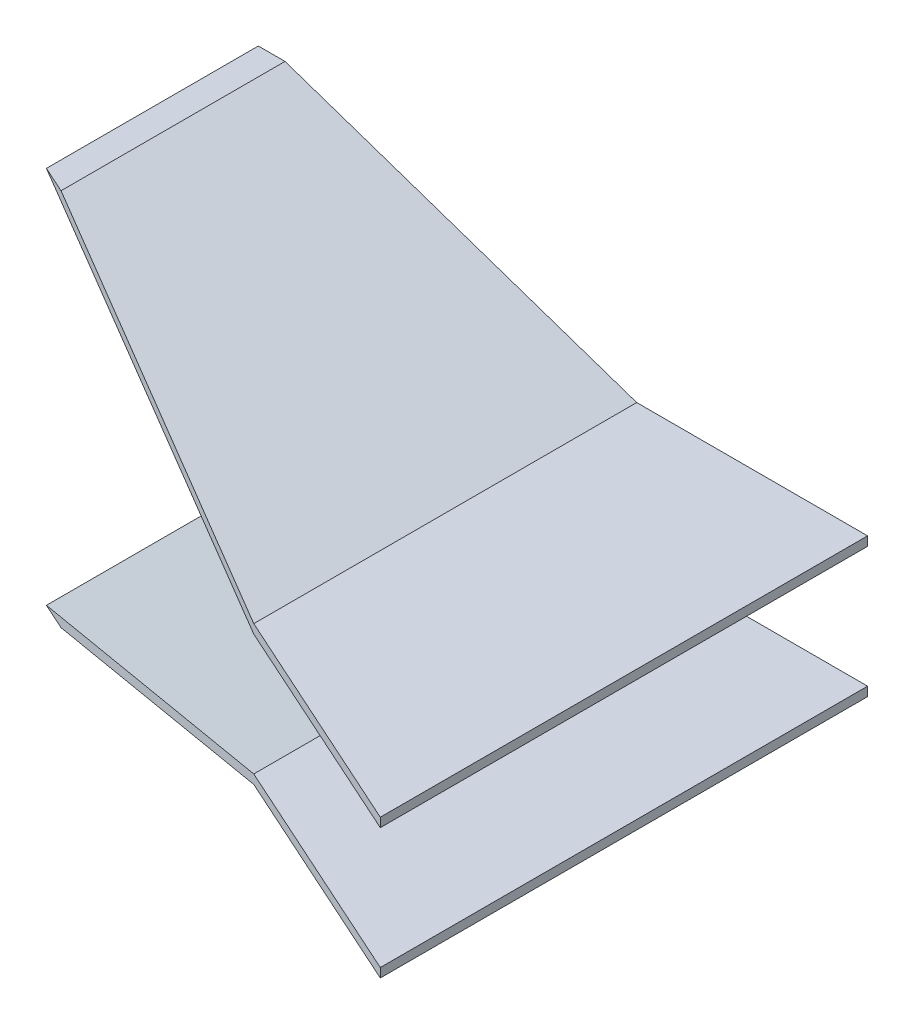
ISO-10303-21;
HEADER;
FILE_DESCRIPTION(('STEP AP214'),'2;1');
FILE_NAME('part.step','',(''),(''),'','','');
FILE_SCHEMA(('AUTOMOTIVE_DESIGN { 1 0 10303 214 1 1 1 1 }'));
ENDSEC;
DATA;
#1=APPLICATION_CONTEXT('core data for automotive mechanical design processes');
#2=APPLICATION_PROTOCOL_DEFINITION('international standard','automotive_design',2000,#1);
#3=PRODUCT_CONTEXT('',#1,'mechanical');
#4=PRODUCT('Part','Part','',(#3));
#5=PRODUCT_RELATED_PRODUCT_CATEGORY('part','',(#4));
#6=PRODUCT_DEFINITION_FORMATION('','',#4);
#7=PRODUCT_DEFINITION_CONTEXT('part definition',#1,'design');
#8=PRODUCT_DEFINITION('design','',#6,#7);
#9=PRODUCT_DEFINITION_SHAPE('','',#8);
#10=(LENGTH_UNIT() NAMED_UNIT(*) SI_UNIT(.MILLI.,.METRE.));
#11=(NAMED_UNIT(*) PLANE_ANGLE_UNIT() SI_UNIT($,.RADIAN.));
#12=(NAMED_UNIT(*) SI_UNIT($,.STERADIAN.) SOLID_ANGLE_UNIT());
#13=UNCERTAINTY_MEASURE_WITH_UNIT(LENGTH_MEASURE(1.E-05),#10,'distance_accuracy_value','');
#14=(GEOMETRIC_REPRESENTATION_CONTEXT(3) GLOBAL_UNCERTAINTY_ASSIGNED_CONTEXT((#13)) GLOBAL_UNIT_ASSIGNED_CONTEXT((#10,
#11,#12)) REPRESENTATION_CONTEXT('',''));
#15=CARTESIAN_POINT('',(0.,0.,0.));
#16=DIRECTION('',(0.,0.,1.));
#17=DIRECTION('',(1.,0.,0.));
#18=AXIS2_PLACEMENT_3D('',#15,#16,#17);
#19=CARTESIAN_POINT('',(408.541281030826,-85.,818.));
#20=DIRECTION('',(0.,-1.,0.));
#21=DIRECTION('',(0.,0.,-1.));
#22=AXIS2_PLACEMENT_3D('',#19,#20,#21);
#23=PLANE('',#22);
#24=DIRECTION('',(0.,0.,-1.));
#25=VECTOR('',#24,1.);
#26=CARTESIAN_POINT('',(408.541281030826,-85.,818.));
#27=LINE('',#26,#25);
#28=CARTESIAN_POINT('',(408.541281030826,-85.,321.948659025934));
#29=VERTEX_POINT('',#28);
#30=CARTESIAN_POINT('',(408.541281030826,-85.,0.));
#31=VERTEX_POINT('',#30);
#32=EDGE_CURVE('E144',#29,#31,#27,.T.);
#33=ORIENTED_EDGE('',*,*,#32,.F.);
#34=DIRECTION('',(-0.911238237938031,0.,-0.41187968354799));
#35=VECTOR('',#34,1.);
#36=CARTESIAN_POINT('',(594.719526822818,-85.,406.101226123914));
#37=LINE('',#36,#35);
#38=CARTESIAN_POINT('',(256.,-85.,253.));
#39=VERTEX_POINT('',#38);
#40=EDGE_CURVE('E154',#29,#39,#37,.T.);
#41=ORIENTED_EDGE('',*,*,#40,.T.);
#42=DIRECTION('',(0.,0.,-1.));
#43=VECTOR('',#42,1.);
#44=CARTESIAN_POINT('',(256.,-85.,253.));
#45=LINE('',#44,#43);
#46=CARTESIAN_POINT('',(256.,-85.,0.));
#47=VERTEX_POINT('',#46);
#48=EDGE_CURVE('E123',#39,#47,#45,.T.);
#49=ORIENTED_EDGE('',*,*,#48,.T.);
#50=DIRECTION('',(-1.,0.,0.));
#51=VECTOR('',#50,1.);
#52=CARTESIAN_POINT('',(408.541281030826,-85.,0.));
#53=LINE('',#52,#51);
#54=EDGE_CURVE('E147',#31,#47,#53,.T.);
#55=ORIENTED_EDGE('',*,*,#54,.F.);
#56=EDGE_LOOP('',(#33,#41,#49,#55));
#57=FACE_BOUND('',#56,.T.);
#58=ADVANCED_FACE('F55',(#57),#23,.T.);
#59=CARTESIAN_POINT('',(408.541281030826,-79.,818.));
#60=DIRECTION('',(1.,0.,0.));
#61=DIRECTION('',(0.,0.,-1.));
#62=AXIS2_PLACEMENT_3D('',#59,#60,#61);
#63=PLANE('',#62);
#64=DIRECTION('',(0.,0.,-1.));
#65=VECTOR('',#64,1.);
#66=CARTESIAN_POINT('',(408.541281030826,-79.,818.));
#67=LINE('',#66,#65);
#68=CARTESIAN_POINT('',(408.541281030826,-79.,321.948659025934));
#69=VERTEX_POINT('',#68);
#70=CARTESIAN_POINT('',(408.541281030826,-79.,0.));
#71=VERTEX_POINT('',#70);
#72=EDGE_CURVE('E145',#69,#71,#67,.T.);
#73=ORIENTED_EDGE('',*,*,#72,.F.);
#74=DIRECTION('',(0.,-1.,0.));
#75=VECTOR('',#74,1.);
#76=CARTESIAN_POINT('',(408.541281030826,-79.,321.948659025934));
#77=LINE('',#76,#75);
#78=EDGE_CURVE('E70',#69,#29,#77,.T.);
#79=ORIENTED_EDGE('',*,*,#78,.T.);
#80=ORIENTED_EDGE('',*,*,#32,.T.);
#81=DIRECTION('',(0.,-1.,0.));
#82=VECTOR('',#81,1.);
#83=CARTESIAN_POINT('',(408.541281030826,-79.,0.));
#84=LINE('',#83,#82);
#85=EDGE_CURVE('E150',#71,#31,#84,.T.);
#86=ORIENTED_EDGE('',*,*,#85,.F.);
#87=EDGE_LOOP('',(#73,#79,#80,#86));
#88=FACE_BOUND('',#87,.T.);
#89=ADVANCED_FACE('F158',(#88),#63,.T.);
#90=CARTESIAN_POINT('',(256.,-79.,818.));
#91=DIRECTION('',(0.,1.,0.));
#92=DIRECTION('',(0.,0.,1.));
#93=AXIS2_PLACEMENT_3D('',#90,#91,#92);
#94=PLANE('',#93);
#95=DIRECTION('',(0.,0.,-1.));
#96=VECTOR('',#95,1.);
#97=CARTESIAN_POINT('',(256.,-79.,253.));
#98=LINE('',#97,#96);
#99=CARTESIAN_POINT('',(256.,-79.,253.));
#100=VERTEX_POINT('',#99);
#101=CARTESIAN_POINT('',(256.,-79.,0.));
#102=VERTEX_POINT('',#101);
#103=EDGE_CURVE('E114',#100,#102,#98,.T.);
#104=ORIENTED_EDGE('',*,*,#103,.F.);
#105=DIRECTION('',(0.911238237938031,0.,0.41187968354799));
#106=VECTOR('',#105,1.);
#107=CARTESIAN_POINT('',(468.056092149491,-79.,348.84935365157));
#108=LINE('',#107,#106);
#109=EDGE_CURVE('E12',#100,#69,#108,.T.);
#110=ORIENTED_EDGE('',*,*,#109,.T.);
#111=ORIENTED_EDGE('',*,*,#72,.T.);
#112=DIRECTION('',(1.,0.,0.));
#113=VECTOR('',#112,1.);
#114=CARTESIAN_POINT('',(256.,-79.,0.));
#115=LINE('',#114,#113);
#116=EDGE_CURVE('E117',#102,#71,#115,.T.);
#117=ORIENTED_EDGE('',*,*,#116,.F.);
#118=EDGE_LOOP('',(#104,#110,#111,#117));
#119=FACE_BOUND('',#118,.T.);
#120=ADVANCED_FACE('F115',(#119),#94,.T.);
#121=CARTESIAN_POINT('',(6.,-250.,140.));
#122=DIRECTION('',(-0.41187968354799,0.,0.911238237938031));
#123=DIRECTION('',(0.911238237938031,0.,0.41187968354799));
#124=AXIS2_PLACEMENT_3D('',#121,#122,#123);
#125=PLANE('',#124);
#126=DIRECTION('',(0.870419931987886,-0.295942776875875,0.393429809258525));
#127=VECTOR('',#126,1.);
#128=CARTESIAN_POINT('',(71.9441898804744,-16.4210245593627,169.806773825974));
#129=LINE('',#128,#127);
#130=CARTESIAN_POINT('',(23.6470588235242,0.,147.976470588233));
#131=VERTEX_POINT('',#130);
#132=EDGE_CURVE('E110',#131,#100,#129,.T.);
#133=ORIENTED_EDGE('',*,*,#132,.F.);
#134=DIRECTION('',(0.911238237938031,0.,0.41187968354799));
#135=VECTOR('',#134,1.);
#136=CARTESIAN_POINT('',(6.,0.,140.));
#137=LINE('',#136,#135);
#138=CARTESIAN_POINT('',(6.,0.,140.));
#139=VERTEX_POINT('',#138);
#140=EDGE_CURVE('E125',#139,#131,#137,.T.);
#141=ORIENTED_EDGE('',*,*,#140,.F.);
#142=DIRECTION('',(-0.870419931987885,0.295942776875881,-0.393429809258524));
#143=VECTOR('',#142,1.);
#144=CARTESIAN_POINT('',(70.3986229301525,-21.8955317962518,169.108177564429));
#145=LINE('',#144,#143);
#146=EDGE_CURVE('E130',#39,#139,#145,.T.);
#147=ORIENTED_EDGE('',*,*,#146,.F.);
#148=ORIENTED_EDGE('',*,*,#40,.F.);
#149=ORIENTED_EDGE('',*,*,#78,.F.);
#150=ORIENTED_EDGE('',*,*,#109,.F.);
#151=EDGE_LOOP('',(#133,#141,#147,#148,#149,#150));
#152=FACE_BOUND('',#151,.T.);
#153=ADVANCED_FACE('F57',(#152),#125,.T.);
#154=CARTESIAN_POINT('',(0.,0.,0.));
#155=DIRECTION('',(0.,-1.,0.));
#156=DIRECTION('',(0.,0.,-1.));
#157=AXIS2_PLACEMENT_3D('',#154,#155,#156);
#158=PLANE('',#157);
#159=ORIENTED_EDGE('',*,*,#140,.T.);
#160=DIRECTION('',(0.,0.,-1.));
#161=VECTOR('',#160,1.);
#162=CARTESIAN_POINT('',(23.6470588235242,0.,0.));
#163=LINE('',#162,#161);
#164=CARTESIAN_POINT('',(23.6470588235242,0.,0.));
#165=VERTEX_POINT('',#164);
#166=EDGE_CURVE('E63',#131,#165,#163,.T.);
#167=ORIENTED_EDGE('',*,*,#166,.T.);
#168=DIRECTION('',(1.,0.,0.));
#169=VECTOR('',#168,1.);
#170=CARTESIAN_POINT('',(23.6470588235242,0.,0.));
#171=LINE('',#170,#169);
#172=CARTESIAN_POINT('',(6.,0.,0.));
#173=VERTEX_POINT('',#172);
#174=EDGE_CURVE('E133',#173,#165,#171,.T.);
#175=ORIENTED_EDGE('',*,*,#174,.F.);
#176=DIRECTION('',(0.,0.,1.));
#177=VECTOR('',#176,1.);
#178=CARTESIAN_POINT('',(6.,0.,0.));
#179=LINE('',#178,#177);
#180=EDGE_CURVE('E77',#173,#139,#179,.T.);
#181=ORIENTED_EDGE('',*,*,#180,.T.);
#182=EDGE_LOOP('',(#159,#167,#175,#181));
#183=FACE_BOUND('',#182,.T.);
#184=ADVANCED_FACE('F132',(#183),#158,.F.);
#185=CARTESIAN_POINT('',(256.,-85.,253.));
#186=DIRECTION('',(0.321902733238702,0.946772744819713,0.));
#187=DIRECTION('',(-0.946772744819713,0.321902733238702,0.));
#188=AXIS2_PLACEMENT_3D('',#185,#186,#187);
#189=PLANE('',#188);
#190=ORIENTED_EDGE('',*,*,#146,.T.);
#191=ORIENTED_EDGE('',*,*,#180,.F.);
#192=DIRECTION('',(-0.946772744819713,0.321902733238702,0.));
#193=VECTOR('',#192,1.);
#194=CARTESIAN_POINT('',(6.,0.,0.));
#195=LINE('',#194,#193);
#196=EDGE_CURVE('E139',#47,#173,#195,.T.);
#197=ORIENTED_EDGE('',*,*,#196,.F.);
#198=ORIENTED_EDGE('',*,*,#48,.F.);
#199=EDGE_LOOP('',(#190,#191,#197,#198));
#200=FACE_BOUND('',#199,.T.);
#201=ADVANCED_FACE('F164',(#200),#189,.F.);
#202=CARTESIAN_POINT('',(2.45034062387888,7.20688418787924,253.));
#203=DIRECTION('',(-0.321902733238696,-0.946772744819715,0.));
#204=DIRECTION('',(0.946772744819715,-0.321902733238696,0.));
#205=AXIS2_PLACEMENT_3D('',#202,#203,#204);
#206=PLANE('',#205);
#207=ORIENTED_EDGE('',*,*,#132,.T.);
#208=ORIENTED_EDGE('',*,*,#103,.T.);
#209=DIRECTION('',(0.946772744819715,-0.321902733238696,0.));
#210=VECTOR('',#209,1.);
#211=CARTESIAN_POINT('',(256.,-79.,0.));
#212=LINE('',#211,#210);
#213=EDGE_CURVE('E136',#165,#102,#212,.T.);
#214=ORIENTED_EDGE('',*,*,#213,.F.);
#215=ORIENTED_EDGE('',*,*,#166,.F.);
#216=EDGE_LOOP('',(#207,#208,#214,#215));
#217=FACE_BOUND('',#216,.T.);
#218=ADVANCED_FACE('F122',(#217),#206,.F.);
#219=CARTESIAN_POINT('',(0.,0.,0.));
#220=DIRECTION('',(0.,0.,1.));
#221=DIRECTION('',(1.,0.,0.));
#222=AXIS2_PLACEMENT_3D('',#219,#220,#221);
#223=PLANE('',#222);
#224=ORIENTED_EDGE('',*,*,#213,.T.);
#225=ORIENTED_EDGE('',*,*,#116,.T.);
#226=ORIENTED_EDGE('',*,*,#85,.T.);
#227=ORIENTED_EDGE('',*,*,#54,.T.);
#228=ORIENTED_EDGE('',*,*,#196,.T.);
#229=ORIENTED_EDGE('',*,*,#174,.T.);
#230=EDGE_LOOP('',(#224,#225,#226,#227,#228,#229));
#231=FACE_BOUND('',#230,.T.);
#232=ADVANCED_FACE('F135',(#231),#223,.F.);
#233=CLOSED_SHELL('',(#58,#89,#120,#153,#184,#201,#218,#232));
#234=MANIFOLD_SOLID_BREP('B2',#233);
#235=CARTESIAN_POINT('',(408.541281030826,-165.,818.));
#236=DIRECTION('',(0.,1.,0.));
#237=DIRECTION('',(0.,0.,1.));
#238=AXIS2_PLACEMENT_3D('',#235,#236,#237);
#239=PLANE('',#238);
#240=DIRECTION('',(0.,0.,-1.));
#241=VECTOR('',#240,1.);
#242=CARTESIAN_POINT('',(256.,-165.,253.));
#243=LINE('',#242,#241);
#244=CARTESIAN_POINT('',(256.,-165.,253.));
#245=VERTEX_POINT('',#244);
#246=CARTESIAN_POINT('',(256.,-165.,0.));
#247=VERTEX_POINT('',#246);
#248=EDGE_CURVE('E341',#245,#247,#243,.T.);
#249=ORIENTED_EDGE('',*,*,#248,.F.);
#250=DIRECTION('',(0.911238237938031,0.,0.41187968354799));
#251=VECTOR('',#250,1.);
#252=CARTESIAN_POINT('',(594.719526822818,-165.,406.101226123914));
#253=LINE('',#252,#251);
#254=CARTESIAN_POINT('',(408.541281030826,-165.,321.948659025934));
#255=VERTEX_POINT('',#254);
#256=EDGE_CURVE('E332',#245,#255,#253,.T.);
#257=ORIENTED_EDGE('',*,*,#256,.T.);
#258=DIRECTION('',(0.,0.,-1.));
#259=VECTOR('',#258,1.);
#260=CARTESIAN_POINT('',(408.541281030826,-165.,818.));
#261=LINE('',#260,#259);
#262=CARTESIAN_POINT('',(408.541281030826,-165.,0.));
#263=VERTEX_POINT('',#262);
#264=EDGE_CURVE('E338',#255,#263,#261,.T.);
#265=ORIENTED_EDGE('',*,*,#264,.T.);
#266=DIRECTION('',(1.,0.,0.));
#267=VECTOR('',#266,1.);
#268=CARTESIAN_POINT('',(408.541281030826,-165.,0.));
#269=LINE('',#268,#267);
#270=EDGE_CURVE('E361',#247,#263,#269,.T.);
#271=ORIENTED_EDGE('',*,*,#270,.F.);
#272=EDGE_LOOP('',(#249,#257,#265,#271));
#273=FACE_BOUND('',#272,.T.);
#274=ADVANCED_FACE('F278',(#273),#239,.T.);
#275=CARTESIAN_POINT('',(256.,-171.,818.));
#276=DIRECTION('',(0.,-1.,0.));
#277=DIRECTION('',(0.,0.,-1.));
#278=AXIS2_PLACEMENT_3D('',#275,#276,#277);
#279=PLANE('',#278);
#280=DIRECTION('',(0.,0.,-1.));
#281=VECTOR('',#280,1.);
#282=CARTESIAN_POINT('',(408.541281030826,-171.,818.));
#283=LINE('',#282,#281);
#284=CARTESIAN_POINT('',(408.541281030826,-171.,321.948659025934));
#285=VERTEX_POINT('',#284);
#286=CARTESIAN_POINT('',(408.541281030826,-171.,0.));
#287=VERTEX_POINT('',#286);
#288=EDGE_CURVE('E343',#285,#287,#283,.T.);
#289=ORIENTED_EDGE('',*,*,#288,.F.);
#290=DIRECTION('',(-0.911238237938031,0.,-0.41187968354799));
#291=VECTOR('',#290,1.);
#292=CARTESIAN_POINT('',(468.056092149491,-171.,348.84935365157));
#293=LINE('',#292,#291);
#294=CARTESIAN_POINT('',(256.,-171.,253.));
#295=VERTEX_POINT('',#294);
#296=EDGE_CURVE('E294',#285,#295,#293,.T.);
#297=ORIENTED_EDGE('',*,*,#296,.T.);
#298=DIRECTION('',(0.,0.,-1.));
#299=VECTOR('',#298,1.);
#300=CARTESIAN_POINT('',(256.,-171.,253.));
#301=LINE('',#300,#299);
#302=CARTESIAN_POINT('',(256.,-171.,0.));
#303=VERTEX_POINT('',#302);
#304=EDGE_CURVE('E377',#295,#303,#301,.T.);
#305=ORIENTED_EDGE('',*,*,#304,.T.);
#306=DIRECTION('',(-1.,0.,0.));
#307=VECTOR('',#306,1.);
#308=CARTESIAN_POINT('',(256.,-171.,0.));
#309=LINE('',#308,#307);
#310=EDGE_CURVE('E350',#287,#303,#309,.T.);
#311=ORIENTED_EDGE('',*,*,#310,.F.);
#312=EDGE_LOOP('',(#289,#297,#305,#311));
#313=FACE_BOUND('',#312,.T.);
#314=ADVANCED_FACE('F404',(#313),#279,.T.);
#315=CARTESIAN_POINT('',(408.541281030826,-171.,818.));
#316=DIRECTION('',(1.,0.,0.));
#317=DIRECTION('',(0.,0.,-1.));
#318=AXIS2_PLACEMENT_3D('',#315,#316,#317);
#319=PLANE('',#318);
#320=ORIENTED_EDGE('',*,*,#264,.F.);
#321=DIRECTION('',(0.,-1.,0.));
#322=VECTOR('',#321,1.);
#323=CARTESIAN_POINT('',(408.541281030826,-171.,321.948659025934));
#324=LINE('',#323,#322);
#325=EDGE_CURVE('E53',#255,#285,#324,.T.);
#326=ORIENTED_EDGE('',*,*,#325,.T.);
#327=ORIENTED_EDGE('',*,*,#288,.T.);
#328=DIRECTION('',(0.,-1.,0.));
#329=VECTOR('',#328,1.);
#330=CARTESIAN_POINT('',(408.541281030826,-171.,0.));
#331=LINE('',#330,#329);
#332=EDGE_CURVE('E347',#263,#287,#331,.T.);
#333=ORIENTED_EDGE('',*,*,#332,.F.);
#334=EDGE_LOOP('',(#320,#326,#327,#333));
#335=FACE_BOUND('',#334,.T.);
#336=ADVANCED_FACE('F345',(#335),#319,.T.);
#337=CARTESIAN_POINT('',(0.,-250.,0.));
#338=DIRECTION('',(0.,-1.,0.));
#339=DIRECTION('',(0.,0.,-1.));
#340=AXIS2_PLACEMENT_3D('',#337,#338,#339);
#341=PLANE('',#340);
#342=DIRECTION('',(0.911238237938031,0.,0.41187968354799));
#343=VECTOR('',#342,1.);
#344=CARTESIAN_POINT('',(6.,-250.,140.));
#345=LINE('',#344,#343);
#346=CARTESIAN_POINT('',(6.,-250.,140.));
#347=VERTEX_POINT('',#346);
#348=CARTESIAN_POINT('',(23.6470588235288,-250.,147.976470588235));
#349=VERTEX_POINT('',#348);
#350=EDGE_CURVE('E287',#347,#349,#345,.T.);
#351=ORIENTED_EDGE('',*,*,#350,.F.);
#352=DIRECTION('',(0.,0.,1.));
#353=VECTOR('',#352,1.);
#354=CARTESIAN_POINT('',(6.,-250.,0.));
#355=LINE('',#354,#353);
#356=CARTESIAN_POINT('',(6.,-250.,0.));
#357=VERTEX_POINT('',#356);
#358=EDGE_CURVE('E301',#357,#347,#355,.T.);
#359=ORIENTED_EDGE('',*,*,#358,.F.);
#360=DIRECTION('',(-1.,0.,0.));
#361=VECTOR('',#360,1.);
#362=CARTESIAN_POINT('',(23.6470588235288,-250.,0.));
#363=LINE('',#362,#361);
#364=CARTESIAN_POINT('',(23.6470588235288,-250.,0.));
#365=VERTEX_POINT('',#364);
#366=EDGE_CURVE('E366',#365,#357,#363,.T.);
#367=ORIENTED_EDGE('',*,*,#366,.F.);
#368=DIRECTION('',(0.,0.,-1.));
#369=VECTOR('',#368,1.);
#370=CARTESIAN_POINT('',(23.6470588235288,-250.,253.));
#371=LINE('',#370,#369);
#372=EDGE_CURVE('E378',#349,#365,#371,.T.);
#373=ORIENTED_EDGE('',*,*,#372,.F.);
#374=EDGE_LOOP('',(#351,#359,#367,#373));
#375=FACE_BOUND('',#374,.T.);
#376=ADVANCED_FACE('F394',(#375),#341,.T.);
#377=CARTESIAN_POINT('',(6.,-250.,140.));
#378=DIRECTION('',(-0.41187968354799,0.,0.911238237938031));
#379=DIRECTION('',(0.911238237938031,0.,0.41187968354799));
#380=AXIS2_PLACEMENT_3D('',#377,#378,#379);
#381=PLANE('',#380);
#382=ORIENTED_EDGE('',*,*,#350,.T.);
#383=DIRECTION('',(0.870419931987885,0.295942776875881,0.393429809258524));
#384=VECTOR('',#383,1.);
#385=CARTESIAN_POINT('',(7.54556695032363,-255.47450723689,140.698596261546));
#386=LINE('',#385,#384);
#387=EDGE_CURVE('E381',#349,#295,#386,.T.);
#388=ORIENTED_EDGE('',*,*,#387,.T.);
#389=ORIENTED_EDGE('',*,*,#296,.F.);
#390=ORIENTED_EDGE('',*,*,#325,.F.);
#391=ORIENTED_EDGE('',*,*,#256,.F.);
#392=DIRECTION('',(0.870419931987885,0.295942776875881,0.393429809258524));
#393=VECTOR('',#392,1.);
#394=CARTESIAN_POINT('',(6.,-250.,140.));
#395=LINE('',#394,#393);
#396=EDGE_CURVE('E388',#347,#245,#395,.T.);
#397=ORIENTED_EDGE('',*,*,#396,.F.);
#398=EDGE_LOOP('',(#382,#388,#389,#390,#391,#397));
#399=FACE_BOUND('',#398,.T.);
#400=ADVANCED_FACE('F280',(#399),#381,.T.);
#401=CARTESIAN_POINT('',(6.,-250.,253.));
#402=DIRECTION('',(0.321902733238702,-0.946772744819713,0.));
#403=DIRECTION('',(0.946772744819713,0.321902733238702,0.));
#404=AXIS2_PLACEMENT_3D('',#401,#402,#403);
#405=PLANE('',#404);
#406=ORIENTED_EDGE('',*,*,#396,.T.);
#407=ORIENTED_EDGE('',*,*,#248,.T.);
#408=DIRECTION('',(0.946772744819713,0.321902733238702,0.));
#409=VECTOR('',#408,1.);
#410=CARTESIAN_POINT('',(6.,-250.,0.));
#411=LINE('',#410,#409);
#412=EDGE_CURVE('E373',#357,#247,#411,.T.);
#413=ORIENTED_EDGE('',*,*,#412,.F.);
#414=ORIENTED_EDGE('',*,*,#358,.T.);
#415=EDGE_LOOP('',(#406,#407,#413,#414));
#416=FACE_BOUND('',#415,.T.);
#417=ADVANCED_FACE('F419',(#416),#405,.F.);
#418=CARTESIAN_POINT('',(78.6425242022229,-231.301541771244,253.));
#419=DIRECTION('',(0.321902733238702,-0.946772744819713,0.));
#420=DIRECTION('',(0.946772744819713,0.321902733238702,0.));
#421=AXIS2_PLACEMENT_3D('',#418,#419,#420);
#422=PLANE('',#421);
#423=ORIENTED_EDGE('',*,*,#372,.T.);
#424=DIRECTION('',(-0.946772744819713,-0.321902733238701,0.));
#425=VECTOR('',#424,1.);
#426=CARTESIAN_POINT('',(256.,-171.,0.));
#427=LINE('',#426,#425);
#428=EDGE_CURVE('E369',#303,#365,#427,.T.);
#429=ORIENTED_EDGE('',*,*,#428,.F.);
#430=ORIENTED_EDGE('',*,*,#304,.F.);
#431=ORIENTED_EDGE('',*,*,#387,.F.);
#432=EDGE_LOOP('',(#423,#429,#430,#431));
#433=FACE_BOUND('',#432,.T.);
#434=ADVANCED_FACE('F398',(#433),#422,.T.);
#435=CARTESIAN_POINT('',(0.,0.,0.));
#436=DIRECTION('',(0.,0.,-1.));
#437=DIRECTION('',(-1.,0.,0.));
#438=AXIS2_PLACEMENT_3D('',#435,#436,#437);
#439=PLANE('',#438);
#440=ORIENTED_EDGE('',*,*,#412,.T.);
#441=ORIENTED_EDGE('',*,*,#270,.T.);
#442=ORIENTED_EDGE('',*,*,#332,.T.);
#443=ORIENTED_EDGE('',*,*,#310,.T.);
#444=ORIENTED_EDGE('',*,*,#428,.T.);
#445=ORIENTED_EDGE('',*,*,#366,.T.);
#446=EDGE_LOOP('',(#440,#441,#442,#443,#444,#445));
#447=FACE_BOUND('',#446,.T.);
#448=ADVANCED_FACE('F401',(#447),#439,.T.);
#449=CLOSED_SHELL('',(#274,#314,#336,#376,#400,#417,#434,#448));
#450=MANIFOLD_SOLID_BREP('B6',#449);
#451=ADVANCED_BREP_SHAPE_REPRESENTATION('',(#18,#234,#450),#14);
#452=SHAPE_DEFINITION_REPRESENTATION(#9,#451);
ENDSEC;
END-ISO-10303-21;
